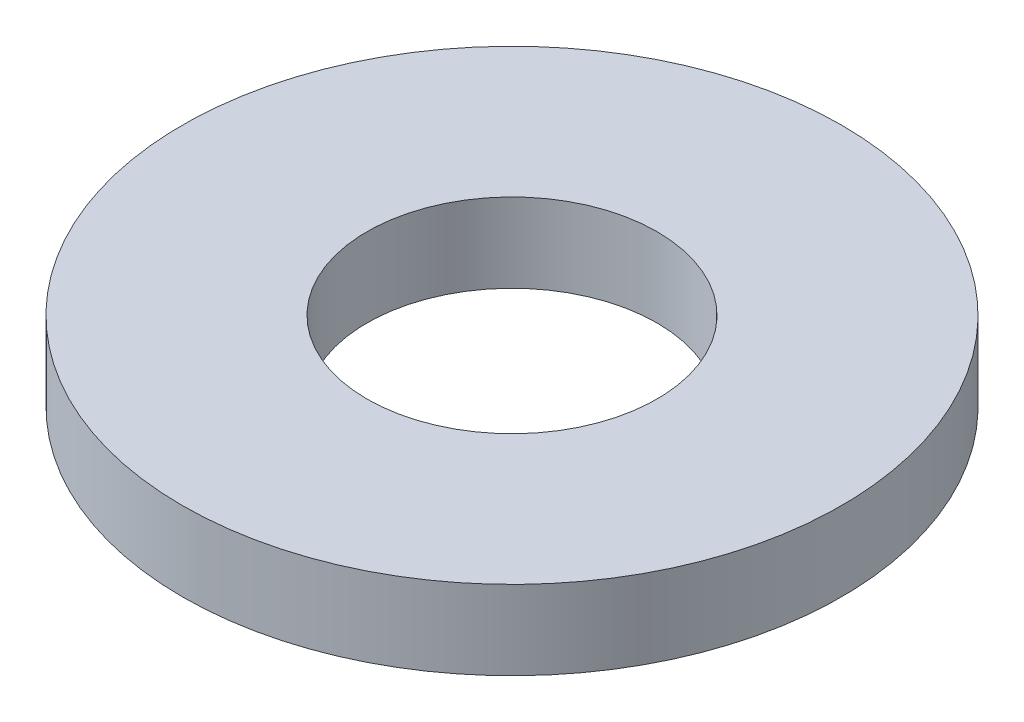
ISO-10303-21;
HEADER;
FILE_DESCRIPTION(('STEP AP214'),'2;1');
FILE_NAME('part.step','',(''),(''),'','','');
FILE_SCHEMA(('AUTOMOTIVE_DESIGN { 1 0 10303 214 1 1 1 1 }'));
ENDSEC;
DATA;
#1=APPLICATION_CONTEXT('core data for automotive mechanical design processes');
#2=APPLICATION_PROTOCOL_DEFINITION('international standard','automotive_design',2000,#1);
#3=PRODUCT_CONTEXT('',#1,'mechanical');
#4=PRODUCT('Part','Part','',(#3));
#5=PRODUCT_RELATED_PRODUCT_CATEGORY('part','',(#4));
#6=PRODUCT_DEFINITION_FORMATION('','',#4);
#7=PRODUCT_DEFINITION_CONTEXT('part definition',#1,'design');
#8=PRODUCT_DEFINITION('design','',#6,#7);
#9=PRODUCT_DEFINITION_SHAPE('','',#8);
#10=(LENGTH_UNIT() NAMED_UNIT(*) SI_UNIT(.MILLI.,.METRE.));
#11=(NAMED_UNIT(*) PLANE_ANGLE_UNIT() SI_UNIT($,.RADIAN.));
#12=(NAMED_UNIT(*) SI_UNIT($,.STERADIAN.) SOLID_ANGLE_UNIT());
#13=UNCERTAINTY_MEASURE_WITH_UNIT(LENGTH_MEASURE(1.E-05),#10,'distance_accuracy_value','');
#14=(GEOMETRIC_REPRESENTATION_CONTEXT(3) GLOBAL_UNCERTAINTY_ASSIGNED_CONTEXT((#13)) GLOBAL_UNIT_ASSIGNED_CONTEXT((#10,
#11,#12)) REPRESENTATION_CONTEXT('',''));
#15=CARTESIAN_POINT('',(0.,0.,0.));
#16=DIRECTION('',(0.,0.,1.));
#17=DIRECTION('',(1.,0.,0.));
#18=AXIS2_PLACEMENT_3D('',#15,#16,#17);
#19=CARTESIAN_POINT('',(0.,0.3,0.));
#20=DIRECTION('',(0.,1.,0.));
#21=DIRECTION('',(0.,0.,1.));
#22=AXIS2_PLACEMENT_3D('',#19,#20,#21);
#23=PLANE('',#22);
#24=CARTESIAN_POINT('',(0.,0.3,0.));
#25=DIRECTION('',(0.,1.,0.));
#26=DIRECTION('',(0.,0.,1.));
#27=AXIS2_PLACEMENT_3D('',#24,#25,#26);
#28=CIRCLE('',#27,1.25);
#29=CARTESIAN_POINT('',(0.,0.3,1.25));
#30=VERTEX_POINT('',#29);
#31=EDGE_CURVE('E10',#30,#30,#28,.T.);
#32=ORIENTED_EDGE('',*,*,#31,.T.);
#33=EDGE_LOOP('',(#32));
#34=FACE_BOUND('',#33,.T.);
#35=CARTESIAN_POINT('',(0.,0.3,0.));
#36=DIRECTION('',(0.,1.,0.));
#37=DIRECTION('',(0.,0.,1.));
#38=AXIS2_PLACEMENT_3D('',#35,#36,#37);
#39=CIRCLE('',#38,0.549999999999998);
#40=CARTESIAN_POINT('',(0.,0.3,0.549999999999998));
#41=VERTEX_POINT('',#40);
#42=EDGE_CURVE('E38',#41,#41,#39,.T.);
#43=ORIENTED_EDGE('',*,*,#42,.F.);
#44=EDGE_LOOP('',(#43));
#45=FACE_BOUND('',#44,.T.);
#46=ADVANCED_FACE('F27',(#34,#45),#23,.T.);
#47=CARTESIAN_POINT('',(0.,0.,0.));
#48=DIRECTION('',(0.,1.,0.));
#49=DIRECTION('',(0.,0.,1.));
#50=AXIS2_PLACEMENT_3D('',#47,#48,#49);
#51=PLANE('',#50);
#52=CARTESIAN_POINT('',(0.,0.,0.));
#53=DIRECTION('',(0.,1.,0.));
#54=DIRECTION('',(0.,0.,1.));
#55=AXIS2_PLACEMENT_3D('',#52,#53,#54);
#56=CIRCLE('',#55,1.25);
#57=CARTESIAN_POINT('',(0.,0.,1.25));
#58=VERTEX_POINT('',#57);
#59=EDGE_CURVE('E34',#58,#58,#56,.T.);
#60=ORIENTED_EDGE('',*,*,#59,.F.);
#61=EDGE_LOOP('',(#60));
#62=FACE_BOUND('',#61,.T.);
#63=CARTESIAN_POINT('',(0.,0.,0.));
#64=DIRECTION('',(0.,1.,0.));
#65=DIRECTION('',(0.,0.,1.));
#66=AXIS2_PLACEMENT_3D('',#63,#64,#65);
#67=CIRCLE('',#66,0.549999999999998);
#68=CARTESIAN_POINT('',(0.,0.,0.549999999999998));
#69=VERTEX_POINT('',#68);
#70=EDGE_CURVE('E42',#69,#69,#67,.T.);
#71=ORIENTED_EDGE('',*,*,#70,.T.);
#72=EDGE_LOOP('',(#71));
#73=FACE_BOUND('',#72,.T.);
#74=ADVANCED_FACE('F48',(#62,#73),#51,.F.);
#75=CARTESIAN_POINT('',(0.,0.3,0.));
#76=DIRECTION('',(0.,-1.,0.));
#77=DIRECTION('',(0.,0.,-1.));
#78=AXIS2_PLACEMENT_3D('',#75,#76,#77);
#79=CYLINDRICAL_SURFACE('',#78,1.25);
#80=ORIENTED_EDGE('',*,*,#31,.F.);
#81=EDGE_LOOP('',(#80));
#82=FACE_BOUND('',#81,.T.);
#83=ORIENTED_EDGE('',*,*,#59,.T.);
#84=EDGE_LOOP('',(#83));
#85=FACE_BOUND('',#84,.T.);
#86=ADVANCED_FACE('F29',(#82,#85),#79,.T.);
#87=CARTESIAN_POINT('',(0.,0.3,0.));
#88=DIRECTION('',(0.,-1.,0.));
#89=DIRECTION('',(0.,0.,-1.));
#90=AXIS2_PLACEMENT_3D('',#87,#88,#89);
#91=CYLINDRICAL_SURFACE('',#90,0.549999999999998);
#92=ORIENTED_EDGE('',*,*,#42,.T.);
#93=EDGE_LOOP('',(#92));
#94=FACE_BOUND('',#93,.T.);
#95=ORIENTED_EDGE('',*,*,#70,.F.);
#96=EDGE_LOOP('',(#95));
#97=FACE_BOUND('',#96,.T.);
#98=ADVANCED_FACE('F50',(#94,#97),#91,.F.);
#99=CLOSED_SHELL('',(#46,#74,#86,#98));
#100=MANIFOLD_SOLID_BREP('B2',#99);
#101=ADVANCED_BREP_SHAPE_REPRESENTATION('',(#18,#100),#14);
#102=SHAPE_DEFINITION_REPRESENTATION(#9,#101);
ENDSEC;
END-ISO-10303-21;
